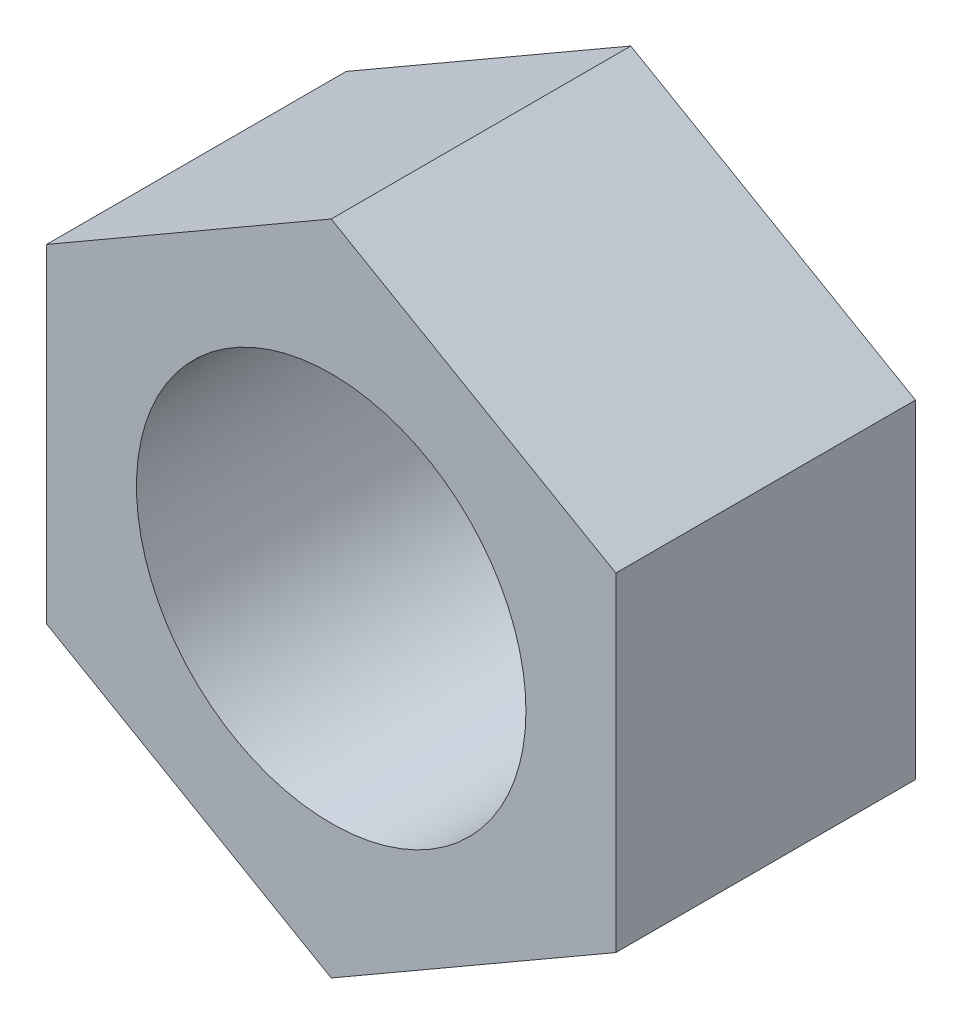
ISO-10303-21;
HEADER;
FILE_DESCRIPTION(('STEP AP214'),'2;1');
FILE_NAME('part.step','',(''),(''),'','','');
FILE_SCHEMA(('AUTOMOTIVE_DESIGN { 1 0 10303 214 1 1 1 1 }'));
ENDSEC;
DATA;
#1=APPLICATION_CONTEXT('core data for automotive mechanical design processes');
#2=APPLICATION_PROTOCOL_DEFINITION('international standard','automotive_design',2000,#1);
#3=PRODUCT_CONTEXT('',#1,'mechanical');
#4=PRODUCT('Part','Part','',(#3));
#5=PRODUCT_RELATED_PRODUCT_CATEGORY('part','',(#4));
#6=PRODUCT_DEFINITION_FORMATION('','',#4);
#7=PRODUCT_DEFINITION_CONTEXT('part definition',#1,'design');
#8=PRODUCT_DEFINITION('design','',#6,#7);
#9=PRODUCT_DEFINITION_SHAPE('','',#8);
#10=(LENGTH_UNIT() NAMED_UNIT(*) SI_UNIT(.MILLI.,.METRE.));
#11=(NAMED_UNIT(*) PLANE_ANGLE_UNIT() SI_UNIT($,.RADIAN.));
#12=(NAMED_UNIT(*) SI_UNIT($,.STERADIAN.) SOLID_ANGLE_UNIT());
#13=UNCERTAINTY_MEASURE_WITH_UNIT(LENGTH_MEASURE(1.E-05),#10,'distance_accuracy_value','');
#14=(GEOMETRIC_REPRESENTATION_CONTEXT(3) GLOBAL_UNCERTAINTY_ASSIGNED_CONTEXT((#13)) GLOBAL_UNIT_ASSIGNED_CONTEXT((#10,
#11,#12)) REPRESENTATION_CONTEXT('',''));
#15=CARTESIAN_POINT('',(0.,0.,0.));
#16=DIRECTION('',(0.,0.,1.));
#17=DIRECTION('',(1.,0.,0.));
#18=AXIS2_PLACEMENT_3D('',#15,#16,#17);
#19=CARTESIAN_POINT('',(0.,0.,5.));
#20=DIRECTION('',(0.,0.,1.));
#21=DIRECTION('',(1.,0.,0.));
#22=AXIS2_PLACEMENT_3D('',#19,#20,#21);
#23=PLANE('',#22);
#24=DIRECTION('',(-0.866025403784439,0.5,0.));
#25=VECTOR('',#24,1.);
#26=CARTESIAN_POINT('',(4.74999999999998,2.74241377865073,5.));
#27=LINE('',#26,#25);
#28=CARTESIAN_POINT('',(4.74999999999998,2.74241377865073,5.));
#29=VERTEX_POINT('',#28);
#30=CARTESIAN_POINT('',(0.,5.48482755730145,5.));
#31=VERTEX_POINT('',#30);
#32=EDGE_CURVE('E129',#29,#31,#27,.T.);
#33=ORIENTED_EDGE('',*,*,#32,.T.);
#34=DIRECTION('',(-0.866025403784439,-0.5,0.));
#35=VECTOR('',#34,1.);
#36=CARTESIAN_POINT('',(0.,5.48482755730145,5.));
#37=LINE('',#36,#35);
#38=CARTESIAN_POINT('',(-4.75,2.74241377865072,5.));
#39=VERTEX_POINT('',#38);
#40=EDGE_CURVE('E87',#31,#39,#37,.T.);
#41=ORIENTED_EDGE('',*,*,#40,.T.);
#42=DIRECTION('',(0.,-1.,0.));
#43=VECTOR('',#42,1.);
#44=CARTESIAN_POINT('',(-4.75,2.74241377865072,5.));
#45=LINE('',#44,#43);
#46=CARTESIAN_POINT('',(-4.75,-2.74241377865073,5.));
#47=VERTEX_POINT('',#46);
#48=EDGE_CURVE('E100',#39,#47,#45,.T.);
#49=ORIENTED_EDGE('',*,*,#48,.T.);
#50=DIRECTION('',(0.866025403784439,-0.499999999999999,0.));
#51=VECTOR('',#50,1.);
#52=CARTESIAN_POINT('',(-4.75,-2.74241377865073,5.));
#53=LINE('',#52,#51);
#54=CARTESIAN_POINT('',(0.,-5.48482755730145,5.));
#55=VERTEX_POINT('',#54);
#56=EDGE_CURVE('E94',#47,#55,#53,.T.);
#57=ORIENTED_EDGE('',*,*,#56,.T.);
#58=DIRECTION('',(0.866025403784439,0.499999999999999,0.));
#59=VECTOR('',#58,1.);
#60=CARTESIAN_POINT('',(0.,-5.48482755730145,5.));
#61=LINE('',#60,#59);
#62=CARTESIAN_POINT('',(4.74999999999999,-2.74241377865073,5.));
#63=VERTEX_POINT('',#62);
#64=EDGE_CURVE('E98',#55,#63,#61,.T.);
#65=ORIENTED_EDGE('',*,*,#64,.T.);
#66=DIRECTION('',(0.,1.,0.));
#67=VECTOR('',#66,1.);
#68=CARTESIAN_POINT('',(4.74999999999999,-2.74241377865073,5.));
#69=LINE('',#68,#67);
#70=EDGE_CURVE('E50',#63,#29,#69,.T.);
#71=ORIENTED_EDGE('',*,*,#70,.T.);
#72=EDGE_LOOP('',(#33,#41,#49,#57,#65,#71));
#73=FACE_BOUND('',#72,.T.);
#74=CARTESIAN_POINT('',(0.,0.,5.));
#75=DIRECTION('',(0.,0.,1.));
#76=DIRECTION('',(1.,0.,0.));
#77=AXIS2_PLACEMENT_3D('',#74,#75,#76);
#78=CIRCLE('',#77,3.25);
#79=CARTESIAN_POINT('',(3.25,0.,5.));
#80=VERTEX_POINT('',#79);
#81=EDGE_CURVE('E122',#80,#80,#78,.T.);
#82=ORIENTED_EDGE('',*,*,#81,.F.);
#83=EDGE_LOOP('',(#82));
#84=FACE_BOUND('',#83,.T.);
#85=ADVANCED_FACE('F33',(#73,#84),#23,.T.);
#86=CARTESIAN_POINT('',(0.,0.,0.));
#87=DIRECTION('',(0.,0.,1.));
#88=DIRECTION('',(1.,0.,0.));
#89=AXIS2_PLACEMENT_3D('',#86,#87,#88);
#90=PLANE('',#89);
#91=DIRECTION('',(-0.866025403784439,0.5,0.));
#92=VECTOR('',#91,1.);
#93=CARTESIAN_POINT('',(4.74999999999998,2.74241377865073,0.));
#94=LINE('',#93,#92);
#95=CARTESIAN_POINT('',(4.74999999999998,2.74241377865073,0.));
#96=VERTEX_POINT('',#95);
#97=CARTESIAN_POINT('',(0.,5.48482755730145,0.));
#98=VERTEX_POINT('',#97);
#99=EDGE_CURVE('E118',#96,#98,#94,.T.);
#100=ORIENTED_EDGE('',*,*,#99,.F.);
#101=DIRECTION('',(0.,1.,0.));
#102=VECTOR('',#101,1.);
#103=CARTESIAN_POINT('',(4.74999999999999,-2.74241377865073,0.));
#104=LINE('',#103,#102);
#105=CARTESIAN_POINT('',(4.74999999999999,-2.74241377865073,0.));
#106=VERTEX_POINT('',#105);
#107=EDGE_CURVE('E79',#106,#96,#104,.T.);
#108=ORIENTED_EDGE('',*,*,#107,.F.);
#109=DIRECTION('',(0.866025403784439,0.499999999999999,0.));
#110=VECTOR('',#109,1.);
#111=CARTESIAN_POINT('',(0.,-5.48482755730145,0.));
#112=LINE('',#111,#110);
#113=CARTESIAN_POINT('',(0.,-5.48482755730145,0.));
#114=VERTEX_POINT('',#113);
#115=EDGE_CURVE('E73',#114,#106,#112,.T.);
#116=ORIENTED_EDGE('',*,*,#115,.F.);
#117=DIRECTION('',(0.866025403784439,-0.499999999999999,0.));
#118=VECTOR('',#117,1.);
#119=CARTESIAN_POINT('',(-4.75,-2.74241377865073,0.));
#120=LINE('',#119,#118);
#121=CARTESIAN_POINT('',(-4.75,-2.74241377865073,0.));
#122=VERTEX_POINT('',#121);
#123=EDGE_CURVE('E108',#122,#114,#120,.T.);
#124=ORIENTED_EDGE('',*,*,#123,.F.);
#125=DIRECTION('',(0.,-1.,0.));
#126=VECTOR('',#125,1.);
#127=CARTESIAN_POINT('',(-4.75,2.74241377865072,0.));
#128=LINE('',#127,#126);
#129=CARTESIAN_POINT('',(-4.75,2.74241377865072,0.));
#130=VERTEX_POINT('',#129);
#131=EDGE_CURVE('E124',#130,#122,#128,.T.);
#132=ORIENTED_EDGE('',*,*,#131,.F.);
#133=DIRECTION('',(-0.866025403784439,-0.5,0.));
#134=VECTOR('',#133,1.);
#135=CARTESIAN_POINT('',(0.,5.48482755730145,0.));
#136=LINE('',#135,#134);
#137=EDGE_CURVE('E121',#98,#130,#136,.T.);
#138=ORIENTED_EDGE('',*,*,#137,.F.);
#139=EDGE_LOOP('',(#100,#108,#116,#124,#132,#138));
#140=FACE_BOUND('',#139,.T.);
#141=CARTESIAN_POINT('',(0.,0.,0.));
#142=DIRECTION('',(0.,0.,1.));
#143=DIRECTION('',(1.,0.,0.));
#144=AXIS2_PLACEMENT_3D('',#141,#142,#143);
#145=CIRCLE('',#144,3.25);
#146=CARTESIAN_POINT('',(3.25,0.,0.));
#147=VERTEX_POINT('',#146);
#148=EDGE_CURVE('E222',#147,#147,#145,.T.);
#149=ORIENTED_EDGE('',*,*,#148,.T.);
#150=EDGE_LOOP('',(#149));
#151=FACE_BOUND('',#150,.T.);
#152=ADVANCED_FACE('F138',(#140,#151),#90,.F.);
#153=CARTESIAN_POINT('',(4.74999999999998,2.74241377865073,5.));
#154=DIRECTION('',(-0.5,-0.866025403784439,0.));
#155=DIRECTION('',(0.866025403784439,-0.5,0.));
#156=AXIS2_PLACEMENT_3D('',#153,#154,#155);
#157=PLANE('',#156);
#158=ORIENTED_EDGE('',*,*,#99,.T.);
#159=DIRECTION('',(0.,0.,-1.));
#160=VECTOR('',#159,1.);
#161=CARTESIAN_POINT('',(0.,5.48482755730145,5.));
#162=LINE('',#161,#160);
#163=EDGE_CURVE('E11',#31,#98,#162,.T.);
#164=ORIENTED_EDGE('',*,*,#163,.F.);
#165=ORIENTED_EDGE('',*,*,#32,.F.);
#166=DIRECTION('',(0.,0.,-1.));
#167=VECTOR('',#166,1.);
#168=CARTESIAN_POINT('',(4.74999999999998,2.74241377865073,5.));
#169=LINE('',#168,#167);
#170=EDGE_CURVE('E114',#29,#96,#169,.T.);
#171=ORIENTED_EDGE('',*,*,#170,.T.);
#172=EDGE_LOOP('',(#158,#164,#165,#171));
#173=FACE_BOUND('',#172,.T.);
#174=ADVANCED_FACE('F35',(#173),#157,.F.);
#175=CARTESIAN_POINT('',(0.,5.48482755730145,5.));
#176=DIRECTION('',(0.5,-0.866025403784439,0.));
#177=DIRECTION('',(0.866025403784439,0.5,0.));
#178=AXIS2_PLACEMENT_3D('',#175,#176,#177);
#179=PLANE('',#178);
#180=ORIENTED_EDGE('',*,*,#137,.T.);
#181=DIRECTION('',(0.,0.,-1.));
#182=VECTOR('',#181,1.);
#183=CARTESIAN_POINT('',(-4.75,2.74241377865072,5.));
#184=LINE('',#183,#182);
#185=EDGE_CURVE('E42',#39,#130,#184,.T.);
#186=ORIENTED_EDGE('',*,*,#185,.F.);
#187=ORIENTED_EDGE('',*,*,#40,.F.);
#188=ORIENTED_EDGE('',*,*,#163,.T.);
#189=EDGE_LOOP('',(#180,#186,#187,#188));
#190=FACE_BOUND('',#189,.T.);
#191=ADVANCED_FACE('F163',(#190),#179,.F.);
#192=CARTESIAN_POINT('',(-4.75,2.74241377865072,5.));
#193=DIRECTION('',(1.,0.,0.));
#194=DIRECTION('',(0.,0.,-1.));
#195=AXIS2_PLACEMENT_3D('',#192,#193,#194);
#196=PLANE('',#195);
#197=ORIENTED_EDGE('',*,*,#131,.T.);
#198=DIRECTION('',(0.,0.,-1.));
#199=VECTOR('',#198,1.);
#200=CARTESIAN_POINT('',(-4.75,-2.74241377865073,5.));
#201=LINE('',#200,#199);
#202=EDGE_CURVE('E109',#47,#122,#201,.T.);
#203=ORIENTED_EDGE('',*,*,#202,.F.);
#204=ORIENTED_EDGE('',*,*,#48,.F.);
#205=ORIENTED_EDGE('',*,*,#185,.T.);
#206=EDGE_LOOP('',(#197,#203,#204,#205));
#207=FACE_BOUND('',#206,.T.);
#208=ADVANCED_FACE('F135',(#207),#196,.F.);
#209=CARTESIAN_POINT('',(-4.75,-2.74241377865073,5.));
#210=DIRECTION('',(0.499999999999999,0.866025403784439,0.));
#211=DIRECTION('',(-0.866025403784439,0.499999999999999,0.));
#212=AXIS2_PLACEMENT_3D('',#209,#210,#211);
#213=PLANE('',#212);
#214=ORIENTED_EDGE('',*,*,#123,.T.);
#215=DIRECTION('',(0.,0.,-1.));
#216=VECTOR('',#215,1.);
#217=CARTESIAN_POINT('',(0.,-5.48482755730145,5.));
#218=LINE('',#217,#216);
#219=EDGE_CURVE('E105',#55,#114,#218,.T.);
#220=ORIENTED_EDGE('',*,*,#219,.F.);
#221=ORIENTED_EDGE('',*,*,#56,.F.);
#222=ORIENTED_EDGE('',*,*,#202,.T.);
#223=EDGE_LOOP('',(#214,#220,#221,#222));
#224=FACE_BOUND('',#223,.T.);
#225=ADVANCED_FACE('F106',(#224),#213,.F.);
#226=CARTESIAN_POINT('',(0.,-5.48482755730145,5.));
#227=DIRECTION('',(-0.499999999999999,0.866025403784439,0.));
#228=DIRECTION('',(-0.866025403784439,-0.499999999999999,0.));
#229=AXIS2_PLACEMENT_3D('',#226,#227,#228);
#230=PLANE('',#229);
#231=ORIENTED_EDGE('',*,*,#115,.T.);
#232=DIRECTION('',(0.,0.,-1.));
#233=VECTOR('',#232,1.);
#234=CARTESIAN_POINT('',(4.74999999999999,-2.74241377865073,5.));
#235=LINE('',#234,#233);
#236=EDGE_CURVE('E110',#63,#106,#235,.T.);
#237=ORIENTED_EDGE('',*,*,#236,.F.);
#238=ORIENTED_EDGE('',*,*,#64,.F.);
#239=ORIENTED_EDGE('',*,*,#219,.T.);
#240=EDGE_LOOP('',(#231,#237,#238,#239));
#241=FACE_BOUND('',#240,.T.);
#242=ADVANCED_FACE('F112',(#241),#230,.F.);
#243=CARTESIAN_POINT('',(4.74999999999999,-2.74241377865073,5.));
#244=DIRECTION('',(-1.,0.,0.));
#245=DIRECTION('',(0.,-1.,0.));
#246=AXIS2_PLACEMENT_3D('',#243,#244,#245);
#247=PLANE('',#246);
#248=ORIENTED_EDGE('',*,*,#107,.T.);
#249=ORIENTED_EDGE('',*,*,#170,.F.);
#250=ORIENTED_EDGE('',*,*,#70,.F.);
#251=ORIENTED_EDGE('',*,*,#236,.T.);
#252=EDGE_LOOP('',(#248,#249,#250,#251));
#253=FACE_BOUND('',#252,.T.);
#254=ADVANCED_FACE('F143',(#253),#247,.F.);
#255=CARTESIAN_POINT('',(0.,0.,5.));
#256=DIRECTION('',(0.,0.,-1.));
#257=DIRECTION('',(-1.,0.,0.));
#258=AXIS2_PLACEMENT_3D('',#255,#256,#257);
#259=CYLINDRICAL_SURFACE('',#258,3.25);
#260=ORIENTED_EDGE('',*,*,#81,.T.);
#261=EDGE_LOOP('',(#260));
#262=FACE_BOUND('',#261,.T.);
#263=ORIENTED_EDGE('',*,*,#148,.F.);
#264=EDGE_LOOP('',(#263));
#265=FACE_BOUND('',#264,.T.);
#266=ADVANCED_FACE('F145',(#262,#265),#259,.F.);
#267=CLOSED_SHELL('',(#85,#152,#174,#191,#208,#225,#242,#254,#266));
#268=MANIFOLD_SOLID_BREP('B2',#267);
#269=ADVANCED_BREP_SHAPE_REPRESENTATION('',(#18,#268),#14);
#270=SHAPE_DEFINITION_REPRESENTATION(#9,#269);
ENDSEC;
END-ISO-10303-21;
